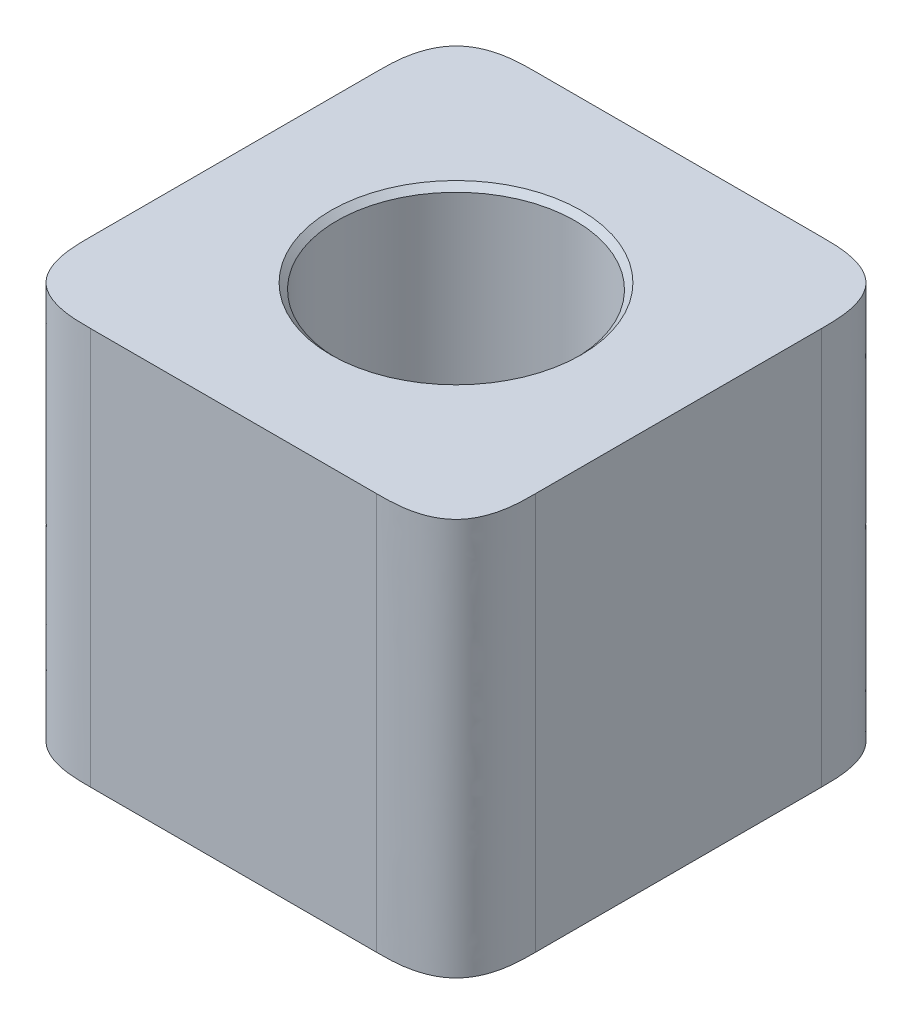
ISO-10303-21;
HEADER;
FILE_DESCRIPTION(('STEP AP214'),'2;1');
FILE_NAME('part.step','',(''),(''),'','','');
FILE_SCHEMA(('AUTOMOTIVE_DESIGN { 1 0 10303 214 1 1 1 1 }'));
ENDSEC;
DATA;
#1=APPLICATION_CONTEXT('core data for automotive mechanical design processes');
#2=APPLICATION_PROTOCOL_DEFINITION('international standard','automotive_design',2000,#1);
#3=PRODUCT_CONTEXT('',#1,'mechanical');
#4=PRODUCT('Part','Part','',(#3));
#5=PRODUCT_RELATED_PRODUCT_CATEGORY('part','',(#4));
#6=PRODUCT_DEFINITION_FORMATION('','',#4);
#7=PRODUCT_DEFINITION_CONTEXT('part definition',#1,'design');
#8=PRODUCT_DEFINITION('design','',#6,#7);
#9=PRODUCT_DEFINITION_SHAPE('','',#8);
#10=(LENGTH_UNIT() NAMED_UNIT(*) SI_UNIT(.MILLI.,.METRE.));
#11=(NAMED_UNIT(*) PLANE_ANGLE_UNIT() SI_UNIT($,.RADIAN.));
#12=(NAMED_UNIT(*) SI_UNIT($,.STERADIAN.) SOLID_ANGLE_UNIT());
#13=UNCERTAINTY_MEASURE_WITH_UNIT(LENGTH_MEASURE(1.E-05),#10,'distance_accuracy_value','');
#14=(GEOMETRIC_REPRESENTATION_CONTEXT(3) GLOBAL_UNCERTAINTY_ASSIGNED_CONTEXT((#13)) GLOBAL_UNIT_ASSIGNED_CONTEXT((#10,
#11,#12)) REPRESENTATION_CONTEXT('',''));
#15=CARTESIAN_POINT('',(0.,0.,0.));
#16=DIRECTION('',(0.,0.,1.));
#17=DIRECTION('',(1.,0.,0.));
#18=AXIS2_PLACEMENT_3D('',#15,#16,#17);
#19=CARTESIAN_POINT('',(0.,9.,0.));
#20=DIRECTION('',(0.,-1.,0.));
#21=DIRECTION('',(0.,0.,-1.));
#22=AXIS2_PLACEMENT_3D('',#19,#20,#21);
#23=PLANE('',#22);
#24=CARTESIAN_POINT('',(0.,9.,0.));
#25=DIRECTION('',(0.,1.,0.));
#26=DIRECTION('',(0.,0.,1.));
#27=AXIS2_PLACEMENT_3D('',#24,#25,#26);
#28=CIRCLE('',#27,3.15);
#29=CARTESIAN_POINT('',(0.,9.,3.15));
#30=VERTEX_POINT('',#29);
#31=EDGE_CURVE('E641',#30,#30,#28,.T.);
#32=ORIENTED_EDGE('',*,*,#31,.F.);
#33=EDGE_LOOP('',(#32));
#34=FACE_BOUND('',#33,.T.);
#35=DIRECTION('',(1.,0.,0.));
#36=VECTOR('',#35,1.);
#37=CARTESIAN_POINT('',(-5.6,9.,5.6));
#38=LINE('',#37,#36);
#39=CARTESIAN_POINT('',(-3.6,9.,5.6));
#40=VERTEX_POINT('',#39);
#41=CARTESIAN_POINT('',(3.6,9.,5.6));
#42=VERTEX_POINT('',#41);
#43=EDGE_CURVE('E143',#40,#42,#38,.T.);
#44=ORIENTED_EDGE('',*,*,#43,.T.);
#45=CARTESIAN_POINT('',(5.6,9.00000000000001,3.6));
#46=CARTESIAN_POINT('',(5.6,9.00000000000001,3.93639610306789));
#47=CARTESIAN_POINT('',(5.6,9.00000000000001,4.27279220613579));
#48=CARTESIAN_POINT('',(5.45661616032783,9.00000000000001,5.0142135623731));
#49=CARTESIAN_POINT('',(5.0142135623731,9.00000000000001,5.45661616032783));
#50=CARTESIAN_POINT('',(4.27279220613579,9.00000000000001,5.6));
#51=CARTESIAN_POINT('',(3.93639610306789,9.00000000000001,5.6));
#52=CARTESIAN_POINT('',(3.6,9.00000000000001,5.6));
#53=B_SPLINE_CURVE_WITH_KNOTS('',5,(#45,#46,#47,#48,#49,#50,#51,#52),.UNSPECIFIED.,.F.,.F.,(6,2,
6),(0.,0.5,1.),.UNSPECIFIED.);
#54=CARTESIAN_POINT('',(5.6,9.,3.6));
#55=VERTEX_POINT('',#54);
#56=EDGE_CURVE('E231',#42,#55,#53,.F.);
#57=ORIENTED_EDGE('',*,*,#56,.T.);
#58=DIRECTION('',(0.,0.,-1.));
#59=VECTOR('',#58,1.);
#60=CARTESIAN_POINT('',(5.6,9.,5.6));
#61=LINE('',#60,#59);
#62=CARTESIAN_POINT('',(5.6,9.,-3.6));
#63=VERTEX_POINT('',#62);
#64=EDGE_CURVE('E275',#55,#63,#61,.T.);
#65=ORIENTED_EDGE('',*,*,#64,.T.);
#66=CARTESIAN_POINT('',(3.6,9.00000000000001,-5.6));
#67=CARTESIAN_POINT('',(3.93639610306789,9.00000000000001,-5.6));
#68=CARTESIAN_POINT('',(4.27279220613579,9.00000000000001,-5.6));
#69=CARTESIAN_POINT('',(5.0142135623731,9.00000000000001,-5.45661616032783));
#70=CARTESIAN_POINT('',(5.45661616032783,9.00000000000001,-5.0142135623731));
#71=CARTESIAN_POINT('',(5.6,9.00000000000001,-4.27279220613579));
#72=CARTESIAN_POINT('',(5.6,9.00000000000001,-3.93639610306789));
#73=CARTESIAN_POINT('',(5.6,9.00000000000001,-3.6));
#74=B_SPLINE_CURVE_WITH_KNOTS('',5,(#66,#67,#68,#69,#70,#71,#72,#73),.UNSPECIFIED.,.F.,.F.,(6,2,
6),(0.,0.5,1.),.UNSPECIFIED.);
#75=CARTESIAN_POINT('',(3.6,9.,-5.6));
#76=VERTEX_POINT('',#75);
#77=EDGE_CURVE('E141',#63,#76,#74,.F.);
#78=ORIENTED_EDGE('',*,*,#77,.T.);
#79=DIRECTION('',(-1.,0.,0.));
#80=VECTOR('',#79,1.);
#81=CARTESIAN_POINT('',(-5.6,9.,-5.6));
#82=LINE('',#81,#80);
#83=CARTESIAN_POINT('',(-3.6,9.,-5.6));
#84=VERTEX_POINT('',#83);
#85=EDGE_CURVE('E277',#76,#84,#82,.T.);
#86=ORIENTED_EDGE('',*,*,#85,.T.);
#87=CARTESIAN_POINT('',(-5.6,9.00000000000001,-3.6));
#88=CARTESIAN_POINT('',(-5.6,9.00000000000001,-3.93639610306789));
#89=CARTESIAN_POINT('',(-5.6,9.00000000000001,-4.27279220613579));
#90=CARTESIAN_POINT('',(-5.45661616032783,9.00000000000001,-5.0142135623731));
#91=CARTESIAN_POINT('',(-5.0142135623731,9.00000000000001,-5.45661616032783));
#92=CARTESIAN_POINT('',(-4.27279220613579,9.00000000000001,-5.6));
#93=CARTESIAN_POINT('',(-3.93639610306789,9.00000000000001,-5.6));
#94=CARTESIAN_POINT('',(-3.6,9.00000000000001,-5.6));
#95=B_SPLINE_CURVE_WITH_KNOTS('',5,(#87,#88,#89,#90,#91,#92,#93,#94),.UNSPECIFIED.,.F.,.F.,(6,2,
6),(0.,0.5,1.),.UNSPECIFIED.);
#96=CARTESIAN_POINT('',(-5.6,9.,-3.6));
#97=VERTEX_POINT('',#96);
#98=EDGE_CURVE('E67',#84,#97,#95,.F.);
#99=ORIENTED_EDGE('',*,*,#98,.T.);
#100=DIRECTION('',(0.,0.,1.));
#101=VECTOR('',#100,1.);
#102=CARTESIAN_POINT('',(-5.6,9.,5.6));
#103=LINE('',#102,#101);
#104=CARTESIAN_POINT('',(-5.6,9.,3.6));
#105=VERTEX_POINT('',#104);
#106=EDGE_CURVE('E287',#97,#105,#103,.T.);
#107=ORIENTED_EDGE('',*,*,#106,.T.);
#108=CARTESIAN_POINT('',(-3.6,9.00000000000001,5.6));
#109=CARTESIAN_POINT('',(-3.93639610306789,9.00000000000001,5.6));
#110=CARTESIAN_POINT('',(-4.27279220613579,9.00000000000001,5.6));
#111=CARTESIAN_POINT('',(-5.0142135623731,9.00000000000001,5.45661616032783));
#112=CARTESIAN_POINT('',(-5.45661616032783,9.00000000000001,5.0142135623731));
#113=CARTESIAN_POINT('',(-5.6,9.00000000000001,4.27279220613579));
#114=CARTESIAN_POINT('',(-5.6,9.00000000000001,3.93639610306789));
#115=CARTESIAN_POINT('',(-5.6,9.00000000000001,3.6));
#116=B_SPLINE_CURVE_WITH_KNOTS('',5,(#108,#109,#110,#111,#112,#113,#114,#115),.UNSPECIFIED.,.F.,
.F.,(6,2,6),(0.,0.5,1.),.UNSPECIFIED.);
#117=EDGE_CURVE('E230',#105,#40,#116,.F.);
#118=ORIENTED_EDGE('',*,*,#117,.T.);
#119=EDGE_LOOP('',(#44,#57,#65,#78,#86,#99,#107,#118));
#120=FACE_BOUND('',#119,.T.);
#121=ADVANCED_FACE('F39',(#34,#120),#23,.F.);
#122=CARTESIAN_POINT('',(5.6,9.,5.6));
#123=DIRECTION('',(-1.,0.,0.));
#124=DIRECTION('',(0.,0.,1.));
#125=AXIS2_PLACEMENT_3D('',#122,#123,#124);
#126=PLANE('',#125);
#127=ORIENTED_EDGE('',*,*,#64,.F.);
#128=CARTESIAN_POINT('',(5.6,-1.5,3.6));
#129=CARTESIAN_POINT('',(5.6,2.16666666666667,3.6));
#130=CARTESIAN_POINT('',(5.6,5.83333333332657,3.6));
#131=CARTESIAN_POINT('',(5.6,9.5,3.6));
#132=B_SPLINE_CURVE_WITH_KNOTS('',3,(#128,#129,#130,#131),.UNSPECIFIED.,.F.,.F.,(4,4),(-0.0005,
0.0105),.UNSPECIFIED.);
#133=CARTESIAN_POINT('',(5.6,-1.,3.6));
#134=VERTEX_POINT('',#133);
#135=EDGE_CURVE('E125',#55,#134,#132,.F.);
#136=ORIENTED_EDGE('',*,*,#135,.T.);
#137=DIRECTION('',(0.,0.,1.));
#138=VECTOR('',#137,1.);
#139=CARTESIAN_POINT('',(5.6,-1.,5.6));
#140=LINE('',#139,#138);
#141=CARTESIAN_POINT('',(5.6,-1.,-3.6));
#142=VERTEX_POINT('',#141);
#143=EDGE_CURVE('E116',#142,#134,#140,.T.);
#144=ORIENTED_EDGE('',*,*,#143,.F.);
#145=CARTESIAN_POINT('',(5.6,9.5,-3.6));
#146=CARTESIAN_POINT('',(5.6,5.83333333332657,-3.6));
#147=CARTESIAN_POINT('',(5.6,2.16666666666667,-3.6));
#148=CARTESIAN_POINT('',(5.6,-1.5,-3.6));
#149=B_SPLINE_CURVE_WITH_KNOTS('',3,(#145,#146,#147,#148),.UNSPECIFIED.,.F.,.F.,(4,4),(-0.0005,
0.0105),.UNSPECIFIED.);
#150=EDGE_CURVE('E132',#142,#63,#149,.F.);
#151=ORIENTED_EDGE('',*,*,#150,.T.);
#152=EDGE_LOOP('',(#127,#136,#144,#151));
#153=FACE_BOUND('',#152,.T.);
#154=ADVANCED_FACE('F131',(#153),#126,.F.);
#155=CARTESIAN_POINT('',(-5.6,9.,-5.6));
#156=DIRECTION('',(0.,0.,1.));
#157=DIRECTION('',(1.,0.,0.));
#158=AXIS2_PLACEMENT_3D('',#155,#156,#157);
#159=PLANE('',#158);
#160=DIRECTION('',(1.,0.,0.));
#161=VECTOR('',#160,1.);
#162=CARTESIAN_POINT('',(-5.6,-1.,-5.6));
#163=LINE('',#162,#161);
#164=CARTESIAN_POINT('',(-3.6,-1.,-5.6));
#165=VERTEX_POINT('',#164);
#166=CARTESIAN_POINT('',(3.6,-1.,-5.6));
#167=VERTEX_POINT('',#166);
#168=EDGE_CURVE('E118',#165,#167,#163,.T.);
#169=ORIENTED_EDGE('',*,*,#168,.F.);
#170=CARTESIAN_POINT('',(-3.6,9.5,-5.6));
#171=CARTESIAN_POINT('',(-3.6,5.83333333332657,-5.6));
#172=CARTESIAN_POINT('',(-3.6,2.16666666666667,-5.6));
#173=CARTESIAN_POINT('',(-3.6,-1.5,-5.6));
#174=B_SPLINE_CURVE_WITH_KNOTS('',3,(#170,#171,#172,#173),.UNSPECIFIED.,.F.,.F.,(4,4),(-0.0005,
0.0105),.UNSPECIFIED.);
#175=EDGE_CURVE('E11',#165,#84,#174,.F.);
#176=ORIENTED_EDGE('',*,*,#175,.T.);
#177=ORIENTED_EDGE('',*,*,#85,.F.);
#178=CARTESIAN_POINT('',(3.6,-1.5,-5.6));
#179=CARTESIAN_POINT('',(3.6,2.16666666666667,-5.6));
#180=CARTESIAN_POINT('',(3.6,5.83333333332657,-5.6));
#181=CARTESIAN_POINT('',(3.6,9.5,-5.6));
#182=B_SPLINE_CURVE_WITH_KNOTS('',3,(#178,#179,#180,#181),.UNSPECIFIED.,.F.,.F.,(4,4),(-0.0005,
0.0105),.UNSPECIFIED.);
#183=EDGE_CURVE('E52',#76,#167,#182,.F.);
#184=ORIENTED_EDGE('',*,*,#183,.T.);
#185=EDGE_LOOP('',(#169,#176,#177,#184));
#186=FACE_BOUND('',#185,.T.);
#187=ADVANCED_FACE('F255',(#186),#159,.F.);
#188=CARTESIAN_POINT('',(-5.6,9.,5.6));
#189=DIRECTION('',(1.,0.,0.));
#190=DIRECTION('',(0.,0.,-1.));
#191=AXIS2_PLACEMENT_3D('',#188,#189,#190);
#192=PLANE('',#191);
#193=DIRECTION('',(0.,0.,-1.));
#194=VECTOR('',#193,1.);
#195=CARTESIAN_POINT('',(-5.6,-1.,5.6));
#196=LINE('',#195,#194);
#197=CARTESIAN_POINT('',(-5.6,-1.,3.6));
#198=VERTEX_POINT('',#197);
#199=CARTESIAN_POINT('',(-5.6,-1.,-3.6));
#200=VERTEX_POINT('',#199);
#201=EDGE_CURVE('E252',#198,#200,#196,.T.);
#202=ORIENTED_EDGE('',*,*,#201,.F.);
#203=CARTESIAN_POINT('',(-5.6,9.5,3.6));
#204=CARTESIAN_POINT('',(-5.6,5.83333333332657,3.6));
#205=CARTESIAN_POINT('',(-5.6,2.16666666666667,3.6));
#206=CARTESIAN_POINT('',(-5.6,-1.5,3.6));
#207=B_SPLINE_CURVE_WITH_KNOTS('',3,(#203,#204,#205,#206),.UNSPECIFIED.,.F.,.F.,(4,4),(-0.0005,
0.0105),.UNSPECIFIED.);
#208=EDGE_CURVE('E59',#198,#105,#207,.F.);
#209=ORIENTED_EDGE('',*,*,#208,.T.);
#210=ORIENTED_EDGE('',*,*,#106,.F.);
#211=CARTESIAN_POINT('',(-5.6,-1.5,-3.6));
#212=CARTESIAN_POINT('',(-5.6,2.16666666666667,-3.6));
#213=CARTESIAN_POINT('',(-5.6,5.83333333332657,-3.6));
#214=CARTESIAN_POINT('',(-5.6,9.5,-3.6));
#215=B_SPLINE_CURVE_WITH_KNOTS('',3,(#211,#212,#213,#214),.UNSPECIFIED.,.F.,.F.,(4,4),(-0.0005,
0.0105),.UNSPECIFIED.);
#216=EDGE_CURVE('E229',#97,#200,#215,.F.);
#217=ORIENTED_EDGE('',*,*,#216,.T.);
#218=EDGE_LOOP('',(#202,#209,#210,#217));
#219=FACE_BOUND('',#218,.T.);
#220=ADVANCED_FACE('F339',(#219),#192,.F.);
#221=CARTESIAN_POINT('',(-5.6,9.,5.6));
#222=DIRECTION('',(0.,0.,-1.));
#223=DIRECTION('',(-1.,0.,0.));
#224=AXIS2_PLACEMENT_3D('',#221,#222,#223);
#225=PLANE('',#224);
#226=DIRECTION('',(-1.,0.,0.));
#227=VECTOR('',#226,1.);
#228=CARTESIAN_POINT('',(-5.6,-1.,5.6));
#229=LINE('',#228,#227);
#230=CARTESIAN_POINT('',(3.6,-1.,5.6));
#231=VERTEX_POINT('',#230);
#232=CARTESIAN_POINT('',(-3.6,-1.,5.6));
#233=VERTEX_POINT('',#232);
#234=EDGE_CURVE('E137',#231,#233,#229,.T.);
#235=ORIENTED_EDGE('',*,*,#234,.F.);
#236=CARTESIAN_POINT('',(3.6,9.5,5.6));
#237=CARTESIAN_POINT('',(3.6,5.83333333332657,5.6));
#238=CARTESIAN_POINT('',(3.6,2.16666666666667,5.6));
#239=CARTESIAN_POINT('',(3.6,-1.5,5.6));
#240=B_SPLINE_CURVE_WITH_KNOTS('',3,(#236,#237,#238,#239),.UNSPECIFIED.,.F.,.F.,(4,4),(-0.0005,
0.0105),.UNSPECIFIED.);
#241=EDGE_CURVE('E232',#231,#42,#240,.F.);
#242=ORIENTED_EDGE('',*,*,#241,.T.);
#243=ORIENTED_EDGE('',*,*,#43,.F.);
#244=CARTESIAN_POINT('',(-3.6,-1.5,5.6));
#245=CARTESIAN_POINT('',(-3.6,2.16666666666667,5.6));
#246=CARTESIAN_POINT('',(-3.6,5.83333333332657,5.6));
#247=CARTESIAN_POINT('',(-3.6,9.5,5.6));
#248=B_SPLINE_CURVE_WITH_KNOTS('',3,(#244,#245,#246,#247),.UNSPECIFIED.,.F.,.F.,(4,4),(-0.0005,
0.0105),.UNSPECIFIED.);
#249=EDGE_CURVE('E235',#40,#233,#248,.F.);
#250=ORIENTED_EDGE('',*,*,#249,.T.);
#251=EDGE_LOOP('',(#235,#242,#243,#250));
#252=FACE_BOUND('',#251,.T.);
#253=ADVANCED_FACE('F307',(#252),#225,.F.);
#254=CARTESIAN_POINT('',(0.,-1.,0.));
#255=DIRECTION('',(0.,-1.,0.));
#256=DIRECTION('',(0.,0.,-1.));
#257=AXIS2_PLACEMENT_3D('',#254,#255,#256);
#258=PLANE('',#257);
#259=ORIENTED_EDGE('',*,*,#143,.T.);
#260=CARTESIAN_POINT('',(3.6,-0.999999999999999,5.6));
#261=CARTESIAN_POINT('',(3.93639610306789,-0.999999999999999,5.6));
#262=CARTESIAN_POINT('',(4.27279220613579,-0.999999999999999,5.6));
#263=CARTESIAN_POINT('',(5.0142135623731,-0.999999999999999,5.45661616032783));
#264=CARTESIAN_POINT('',(5.45661616032783,-0.999999999999999,5.0142135623731));
#265=CARTESIAN_POINT('',(5.6,-0.999999999999999,4.27279220613579));
#266=CARTESIAN_POINT('',(5.6,-0.999999999999999,3.93639610306789));
#267=CARTESIAN_POINT('',(5.6,-0.999999999999999,3.6));
#268=B_SPLINE_CURVE_WITH_KNOTS('',5,(#260,#261,#262,#263,#264,#265,#266,#267),.UNSPECIFIED.,.F.,
.F.,(6,2,6),(0.,0.5,1.),.UNSPECIFIED.);
#269=EDGE_CURVE('E243',#134,#231,#268,.F.);
#270=ORIENTED_EDGE('',*,*,#269,.T.);
#271=ORIENTED_EDGE('',*,*,#234,.T.);
#272=CARTESIAN_POINT('',(-5.6,-0.999999999999999,3.6));
#273=CARTESIAN_POINT('',(-5.6,-0.999999999999999,3.93639610306789));
#274=CARTESIAN_POINT('',(-5.6,-0.999999999999999,4.27279220613579));
#275=CARTESIAN_POINT('',(-5.45661616032783,-0.999999999999999,5.0142135623731));
#276=CARTESIAN_POINT('',(-5.0142135623731,-0.999999999999999,5.45661616032783));
#277=CARTESIAN_POINT('',(-4.27279220613579,-0.999999999999999,5.6));
#278=CARTESIAN_POINT('',(-3.93639610306789,-0.999999999999999,5.6));
#279=CARTESIAN_POINT('',(-3.6,-0.999999999999999,5.6));
#280=B_SPLINE_CURVE_WITH_KNOTS('',5,(#272,#273,#274,#275,#276,#277,#278,#279),.UNSPECIFIED.,.F.,
.F.,(6,2,6),(0.,0.5,1.),.UNSPECIFIED.);
#281=EDGE_CURVE('E247',#233,#198,#280,.F.);
#282=ORIENTED_EDGE('',*,*,#281,.T.);
#283=ORIENTED_EDGE('',*,*,#201,.T.);
#284=CARTESIAN_POINT('',(-3.6,-0.999999999999999,-5.6));
#285=CARTESIAN_POINT('',(-3.93639610306789,-0.999999999999999,-5.6));
#286=CARTESIAN_POINT('',(-4.27279220613579,-0.999999999999999,-5.6));
#287=CARTESIAN_POINT('',(-5.0142135623731,-0.999999999999999,-5.45661616032783));
#288=CARTESIAN_POINT('',(-5.45661616032783,-0.999999999999999,-5.0142135623731));
#289=CARTESIAN_POINT('',(-5.6,-0.999999999999999,-4.27279220613579));
#290=CARTESIAN_POINT('',(-5.6,-0.999999999999999,-3.93639610306789));
#291=CARTESIAN_POINT('',(-5.6,-0.999999999999999,-3.6));
#292=B_SPLINE_CURVE_WITH_KNOTS('',5,(#284,#285,#286,#287,#288,#289,#290,#291),.UNSPECIFIED.,.F.,
.F.,(6,2,6),(0.,0.5,1.),.UNSPECIFIED.);
#293=EDGE_CURVE('E124',#200,#165,#292,.F.);
#294=ORIENTED_EDGE('',*,*,#293,.T.);
#295=ORIENTED_EDGE('',*,*,#168,.T.);
#296=CARTESIAN_POINT('',(5.6,-0.999999999999999,-3.6));
#297=CARTESIAN_POINT('',(5.6,-0.999999999999999,-3.93639610306789));
#298=CARTESIAN_POINT('',(5.6,-0.999999999999999,-4.27279220613579));
#299=CARTESIAN_POINT('',(5.45661616032783,-0.999999999999999,-5.0142135623731));
#300=CARTESIAN_POINT('',(5.0142135623731,-0.999999999999999,-5.45661616032783));
#301=CARTESIAN_POINT('',(4.27279220613579,-0.999999999999999,-5.6));
#302=CARTESIAN_POINT('',(3.93639610306789,-0.999999999999999,-5.6));
#303=CARTESIAN_POINT('',(3.6,-0.999999999999999,-5.6));
#304=B_SPLINE_CURVE_WITH_KNOTS('',5,(#296,#297,#298,#299,#300,#301,#302,#303),.UNSPECIFIED.,.F.,
.F.,(6,2,6),(0.,0.5,1.),.UNSPECIFIED.);
#305=EDGE_CURVE('E112',#167,#142,#304,.F.);
#306=ORIENTED_EDGE('',*,*,#305,.T.);
#307=EDGE_LOOP('',(#259,#270,#271,#282,#283,#294,#295,#306));
#308=FACE_BOUND('',#307,.T.);
#309=ADVANCED_FACE('F115',(#308),#258,.T.);
#310=CARTESIAN_POINT('',(5.6,9.5,3.6));
#311=CARTESIAN_POINT('',(5.6,5.83333333332657,3.6));
#312=CARTESIAN_POINT('',(5.6,2.16666666666667,3.6));
#313=CARTESIAN_POINT('',(5.6,-1.5,3.6));
#314=CARTESIAN_POINT('',(5.6,9.5,3.93639610306789));
#315=CARTESIAN_POINT('',(5.6,5.83333333332657,3.93639610306789));
#316=CARTESIAN_POINT('',(5.6,2.16666666666667,3.93639610306789));
#317=CARTESIAN_POINT('',(5.6,-1.5,3.93639610306789));
#318=CARTESIAN_POINT('',(5.6,9.5,4.27279220613579));
#319=CARTESIAN_POINT('',(5.6,5.83333333332657,4.27279220613579));
#320=CARTESIAN_POINT('',(5.6,2.16666666666667,4.27279220613579));
#321=CARTESIAN_POINT('',(5.6,-1.5,4.27279220613579));
#322=CARTESIAN_POINT('',(5.45661616032783,9.5,5.0142135623731));
#323=CARTESIAN_POINT('',(5.45661616032783,5.83333333332657,5.0142135623731));
#324=CARTESIAN_POINT('',(5.45661616032783,2.16666666666667,5.0142135623731));
#325=CARTESIAN_POINT('',(5.45661616032783,-1.5,5.0142135623731));
#326=CARTESIAN_POINT('',(5.0142135623731,9.5,5.45661616032783));
#327=CARTESIAN_POINT('',(5.0142135623731,5.83333333332657,5.45661616032783));
#328=CARTESIAN_POINT('',(5.0142135623731,2.16666666666667,5.45661616032783));
#329=CARTESIAN_POINT('',(5.0142135623731,-1.5,5.45661616032783));
#330=CARTESIAN_POINT('',(4.27279220613579,9.5,5.6));
#331=CARTESIAN_POINT('',(4.27279220613579,5.83333333332657,5.6));
#332=CARTESIAN_POINT('',(4.27279220613579,2.16666666666667,5.6));
#333=CARTESIAN_POINT('',(4.27279220613579,-1.5,5.6));
#334=CARTESIAN_POINT('',(3.93639610306789,9.5,5.6));
#335=CARTESIAN_POINT('',(3.93639610306789,5.83333333332657,5.6));
#336=CARTESIAN_POINT('',(3.93639610306789,2.16666666666667,5.6));
#337=CARTESIAN_POINT('',(3.93639610306789,-1.5,5.6));
#338=CARTESIAN_POINT('',(3.6,9.5,5.6));
#339=CARTESIAN_POINT('',(3.6,5.83333333332657,5.6));
#340=CARTESIAN_POINT('',(3.6,2.16666666666667,5.6));
#341=CARTESIAN_POINT('',(3.6,-1.5,5.6));
#342=B_SPLINE_SURFACE_WITH_KNOTS('',5,3,((#310,#311,#312,#313),(#314,#315,#316,#317),(#318,#319,
#320,#321),(#322,#323,#324,#325),(#326,#327,#328,#329),(#330,#331,#332,#333),(#334,#335,#336,
#337),(#338,#339,#340,#341)),.UNSPECIFIED.,.F.,.F.,.F.,(6,2,6),(4,4),(0.,0.5,1.),(-0.0005,
0.0105),.UNSPECIFIED.);
#343=ORIENTED_EDGE('',*,*,#56,.F.);
#344=ORIENTED_EDGE('',*,*,#241,.F.);
#345=ORIENTED_EDGE('',*,*,#269,.F.);
#346=ORIENTED_EDGE('',*,*,#135,.F.);
#347=EDGE_LOOP('',(#343,#344,#345,#346));
#348=FACE_BOUND('',#347,.T.);
#349=ADVANCED_FACE('F382',(#348),#342,.T.);
#350=CARTESIAN_POINT('',(-3.6,9.5,5.6));
#351=CARTESIAN_POINT('',(-3.6,5.83333333332657,5.6));
#352=CARTESIAN_POINT('',(-3.6,2.16666666666667,5.6));
#353=CARTESIAN_POINT('',(-3.6,-1.5,5.6));
#354=CARTESIAN_POINT('',(-3.93639610306789,9.5,5.6));
#355=CARTESIAN_POINT('',(-3.93639610306789,5.83333333332657,5.6));
#356=CARTESIAN_POINT('',(-3.93639610306789,2.16666666666667,5.6));
#357=CARTESIAN_POINT('',(-3.93639610306789,-1.5,5.6));
#358=CARTESIAN_POINT('',(-4.27279220613579,9.5,5.6));
#359=CARTESIAN_POINT('',(-4.27279220613579,5.83333333332657,5.6));
#360=CARTESIAN_POINT('',(-4.27279220613579,2.16666666666667,5.6));
#361=CARTESIAN_POINT('',(-4.27279220613579,-1.5,5.6));
#362=CARTESIAN_POINT('',(-5.0142135623731,9.5,5.45661616032783));
#363=CARTESIAN_POINT('',(-5.0142135623731,5.83333333332657,5.45661616032783));
#364=CARTESIAN_POINT('',(-5.0142135623731,2.16666666666667,5.45661616032783));
#365=CARTESIAN_POINT('',(-5.0142135623731,-1.5,5.45661616032783));
#366=CARTESIAN_POINT('',(-5.45661616032783,9.5,5.0142135623731));
#367=CARTESIAN_POINT('',(-5.45661616032783,5.83333333332657,5.0142135623731));
#368=CARTESIAN_POINT('',(-5.45661616032783,2.16666666666667,5.0142135623731));
#369=CARTESIAN_POINT('',(-5.45661616032783,-1.5,5.0142135623731));
#370=CARTESIAN_POINT('',(-5.6,9.5,4.27279220613579));
#371=CARTESIAN_POINT('',(-5.6,5.83333333332657,4.27279220613579));
#372=CARTESIAN_POINT('',(-5.6,2.16666666666667,4.27279220613579));
#373=CARTESIAN_POINT('',(-5.6,-1.5,4.27279220613579));
#374=CARTESIAN_POINT('',(-5.6,9.5,3.93639610306789));
#375=CARTESIAN_POINT('',(-5.6,5.83333333332657,3.93639610306789));
#376=CARTESIAN_POINT('',(-5.6,2.16666666666667,3.93639610306789));
#377=CARTESIAN_POINT('',(-5.6,-1.5,3.93639610306789));
#378=CARTESIAN_POINT('',(-5.6,9.5,3.6));
#379=CARTESIAN_POINT('',(-5.6,5.83333333332657,3.6));
#380=CARTESIAN_POINT('',(-5.6,2.16666666666667,3.6));
#381=CARTESIAN_POINT('',(-5.6,-1.5,3.6));
#382=B_SPLINE_SURFACE_WITH_KNOTS('',5,3,((#350,#351,#352,#353),(#354,#355,#356,#357),(#358,#359,
#360,#361),(#362,#363,#364,#365),(#366,#367,#368,#369),(#370,#371,#372,#373),(#374,#375,#376,
#377),(#378,#379,#380,#381)),.UNSPECIFIED.,.F.,.F.,.F.,(6,2,6),(4,4),(0.,0.5,1.),(-0.0005,
0.0105),.UNSPECIFIED.);
#383=ORIENTED_EDGE('',*,*,#117,.F.);
#384=ORIENTED_EDGE('',*,*,#208,.F.);
#385=ORIENTED_EDGE('',*,*,#281,.F.);
#386=ORIENTED_EDGE('',*,*,#249,.F.);
#387=EDGE_LOOP('',(#383,#384,#385,#386));
#388=FACE_BOUND('',#387,.T.);
#389=ADVANCED_FACE('F197',(#388),#382,.T.);
#390=CARTESIAN_POINT('',(-5.6,9.5,-3.6));
#391=CARTESIAN_POINT('',(-5.6,5.83333333332657,-3.6));
#392=CARTESIAN_POINT('',(-5.6,2.16666666666667,-3.6));
#393=CARTESIAN_POINT('',(-5.6,-1.5,-3.6));
#394=CARTESIAN_POINT('',(-5.6,9.5,-3.93639610306789));
#395=CARTESIAN_POINT('',(-5.6,5.83333333332657,-3.93639610306789));
#396=CARTESIAN_POINT('',(-5.6,2.16666666666667,-3.93639610306789));
#397=CARTESIAN_POINT('',(-5.6,-1.5,-3.93639610306789));
#398=CARTESIAN_POINT('',(-5.6,9.5,-4.27279220613579));
#399=CARTESIAN_POINT('',(-5.6,5.83333333332657,-4.27279220613579));
#400=CARTESIAN_POINT('',(-5.6,2.16666666666667,-4.27279220613579));
#401=CARTESIAN_POINT('',(-5.6,-1.5,-4.27279220613579));
#402=CARTESIAN_POINT('',(-5.45661616032783,9.5,-5.0142135623731));
#403=CARTESIAN_POINT('',(-5.45661616032783,5.83333333332657,-5.0142135623731));
#404=CARTESIAN_POINT('',(-5.45661616032783,2.16666666666667,-5.0142135623731));
#405=CARTESIAN_POINT('',(-5.45661616032783,-1.5,-5.0142135623731));
#406=CARTESIAN_POINT('',(-5.0142135623731,9.5,-5.45661616032783));
#407=CARTESIAN_POINT('',(-5.0142135623731,5.83333333332657,-5.45661616032783));
#408=CARTESIAN_POINT('',(-5.0142135623731,2.16666666666667,-5.45661616032783));
#409=CARTESIAN_POINT('',(-5.0142135623731,-1.5,-5.45661616032783));
#410=CARTESIAN_POINT('',(-4.27279220613579,9.5,-5.6));
#411=CARTESIAN_POINT('',(-4.27279220613579,5.83333333332657,-5.6));
#412=CARTESIAN_POINT('',(-4.27279220613579,2.16666666666667,-5.6));
#413=CARTESIAN_POINT('',(-4.27279220613579,-1.5,-5.6));
#414=CARTESIAN_POINT('',(-3.93639610306789,9.5,-5.6));
#415=CARTESIAN_POINT('',(-3.93639610306789,5.83333333332657,-5.6));
#416=CARTESIAN_POINT('',(-3.93639610306789,2.16666666666667,-5.6));
#417=CARTESIAN_POINT('',(-3.93639610306789,-1.5,-5.6));
#418=CARTESIAN_POINT('',(-3.6,9.5,-5.6));
#419=CARTESIAN_POINT('',(-3.6,5.83333333332657,-5.6));
#420=CARTESIAN_POINT('',(-3.6,2.16666666666667,-5.6));
#421=CARTESIAN_POINT('',(-3.6,-1.5,-5.6));
#422=B_SPLINE_SURFACE_WITH_KNOTS('',5,3,((#390,#391,#392,#393),(#394,#395,#396,#397),(#398,#399,
#400,#401),(#402,#403,#404,#405),(#406,#407,#408,#409),(#410,#411,#412,#413),(#414,#415,#416,
#417),(#418,#419,#420,#421)),.UNSPECIFIED.,.F.,.F.,.F.,(6,2,6),(4,4),(0.,0.5,1.),(-0.0005,
0.0105),.UNSPECIFIED.);
#423=ORIENTED_EDGE('',*,*,#98,.F.);
#424=ORIENTED_EDGE('',*,*,#175,.F.);
#425=ORIENTED_EDGE('',*,*,#293,.F.);
#426=ORIENTED_EDGE('',*,*,#216,.F.);
#427=EDGE_LOOP('',(#423,#424,#425,#426));
#428=FACE_BOUND('',#427,.T.);
#429=ADVANCED_FACE('F183',(#428),#422,.T.);
#430=CARTESIAN_POINT('',(3.6,9.5,-5.6));
#431=CARTESIAN_POINT('',(3.6,5.83333333332657,-5.6));
#432=CARTESIAN_POINT('',(3.6,2.16666666666667,-5.6));
#433=CARTESIAN_POINT('',(3.6,-1.5,-5.6));
#434=CARTESIAN_POINT('',(3.93639610306789,9.5,-5.6));
#435=CARTESIAN_POINT('',(3.93639610306789,5.83333333332657,-5.6));
#436=CARTESIAN_POINT('',(3.93639610306789,2.16666666666667,-5.6));
#437=CARTESIAN_POINT('',(3.93639610306789,-1.5,-5.6));
#438=CARTESIAN_POINT('',(4.27279220613579,9.5,-5.6));
#439=CARTESIAN_POINT('',(4.27279220613579,5.83333333332657,-5.6));
#440=CARTESIAN_POINT('',(4.27279220613579,2.16666666666667,-5.6));
#441=CARTESIAN_POINT('',(4.27279220613579,-1.5,-5.6));
#442=CARTESIAN_POINT('',(5.0142135623731,9.5,-5.45661616032783));
#443=CARTESIAN_POINT('',(5.0142135623731,5.83333333332657,-5.45661616032783));
#444=CARTESIAN_POINT('',(5.0142135623731,2.16666666666667,-5.45661616032783));
#445=CARTESIAN_POINT('',(5.0142135623731,-1.5,-5.45661616032783));
#446=CARTESIAN_POINT('',(5.45661616032783,9.5,-5.0142135623731));
#447=CARTESIAN_POINT('',(5.45661616032783,5.83333333332657,-5.0142135623731));
#448=CARTESIAN_POINT('',(5.45661616032783,2.16666666666667,-5.0142135623731));
#449=CARTESIAN_POINT('',(5.45661616032783,-1.5,-5.0142135623731));
#450=CARTESIAN_POINT('',(5.6,9.5,-4.27279220613579));
#451=CARTESIAN_POINT('',(5.6,5.83333333332657,-4.27279220613579));
#452=CARTESIAN_POINT('',(5.6,2.16666666666667,-4.27279220613579));
#453=CARTESIAN_POINT('',(5.6,-1.5,-4.27279220613579));
#454=CARTESIAN_POINT('',(5.6,9.5,-3.93639610306789));
#455=CARTESIAN_POINT('',(5.6,5.83333333332657,-3.93639610306789));
#456=CARTESIAN_POINT('',(5.6,2.16666666666667,-3.93639610306789));
#457=CARTESIAN_POINT('',(5.6,-1.5,-3.93639610306789));
#458=CARTESIAN_POINT('',(5.6,9.5,-3.6));
#459=CARTESIAN_POINT('',(5.6,5.83333333332657,-3.6));
#460=CARTESIAN_POINT('',(5.6,2.16666666666667,-3.6));
#461=CARTESIAN_POINT('',(5.6,-1.5,-3.6));
#462=B_SPLINE_SURFACE_WITH_KNOTS('',5,3,((#430,#431,#432,#433),(#434,#435,#436,#437),(#438,#439,
#440,#441),(#442,#443,#444,#445),(#446,#447,#448,#449),(#450,#451,#452,#453),(#454,#455,#456,
#457),(#458,#459,#460,#461)),.UNSPECIFIED.,.F.,.F.,.F.,(6,2,6),(4,4),(0.,0.5,1.),(-0.0005,
0.0105),.UNSPECIFIED.);
#463=ORIENTED_EDGE('',*,*,#77,.F.);
#464=ORIENTED_EDGE('',*,*,#150,.F.);
#465=ORIENTED_EDGE('',*,*,#305,.F.);
#466=ORIENTED_EDGE('',*,*,#183,.F.);
#467=EDGE_LOOP('',(#463,#464,#465,#466));
#468=FACE_BOUND('',#467,.T.);
#469=ADVANCED_FACE('F42',(#468),#462,.T.);
#470=CARTESIAN_POINT('',(0.,9.,0.));
#471=DIRECTION('',(0.,1.,0.));
#472=DIRECTION('',(0.,0.,1.));
#473=AXIS2_PLACEMENT_3D('',#470,#471,#472);
#474=CONICAL_SURFACE('',#473,3.15,0.785398163397449);
#475=CARTESIAN_POINT('',(0.,8.85,0.));
#476=DIRECTION('',(0.,1.,0.));
#477=DIRECTION('',(0.,0.,1.));
#478=AXIS2_PLACEMENT_3D('',#475,#476,#477);
#479=CIRCLE('',#478,3.);
#480=CARTESIAN_POINT('',(0.,8.85,3.));
#481=VERTEX_POINT('',#480);
#482=EDGE_CURVE('E47',#481,#481,#479,.F.);
#483=ORIENTED_EDGE('',*,*,#482,.T.);
#484=EDGE_LOOP('',(#483));
#485=FACE_BOUND('',#484,.T.);
#486=ORIENTED_EDGE('',*,*,#31,.T.);
#487=EDGE_LOOP('',(#486));
#488=FACE_BOUND('',#487,.T.);
#489=ADVANCED_FACE('F477',(#485,#488),#474,.F.);
#490=CARTESIAN_POINT('',(0.,0.,0.));
#491=DIRECTION('',(0.,-1.,0.));
#492=DIRECTION('',(0.,0.,-1.));
#493=AXIS2_PLACEMENT_3D('',#490,#491,#492);
#494=PLANE('',#493);
#495=CARTESIAN_POINT('',(0.,0.,0.));
#496=DIRECTION('',(0.,1.,0.));
#497=DIRECTION('',(0.,0.,1.));
#498=AXIS2_PLACEMENT_3D('',#495,#496,#497);
#499=CIRCLE('',#498,3.);
#500=CARTESIAN_POINT('',(0.,0.,3.));
#501=VERTEX_POINT('',#500);
#502=EDGE_CURVE('E278',#501,#501,#499,.T.);
#503=ORIENTED_EDGE('',*,*,#502,.T.);
#504=EDGE_LOOP('',(#503));
#505=FACE_BOUND('',#504,.T.);
#506=ADVANCED_FACE('F484',(#505),#494,.F.);
#507=CARTESIAN_POINT('',(0.,9.,0.));
#508=DIRECTION('',(0.,-1.,0.));
#509=DIRECTION('',(0.,0.,-1.));
#510=AXIS2_PLACEMENT_3D('',#507,#508,#509);
#511=CYLINDRICAL_SURFACE('',#510,3.);
#512=ORIENTED_EDGE('',*,*,#482,.F.);
#513=EDGE_LOOP('',(#512));
#514=FACE_BOUND('',#513,.T.);
#515=ORIENTED_EDGE('',*,*,#502,.F.);
#516=EDGE_LOOP('',(#515));
#517=FACE_BOUND('',#516,.T.);
#518=ADVANCED_FACE('F305',(#514,#517),#511,.F.);
#519=CLOSED_SHELL('',(#121,#154,#187,#220,#253,#309,#349,#389,#429,#469,#489,#506,#518));
#520=MANIFOLD_SOLID_BREP('B2',#519);
#521=ADVANCED_BREP_SHAPE_REPRESENTATION('',(#18,#520),#14);
#522=SHAPE_DEFINITION_REPRESENTATION(#9,#521);
ENDSEC;
END-ISO-10303-21;
